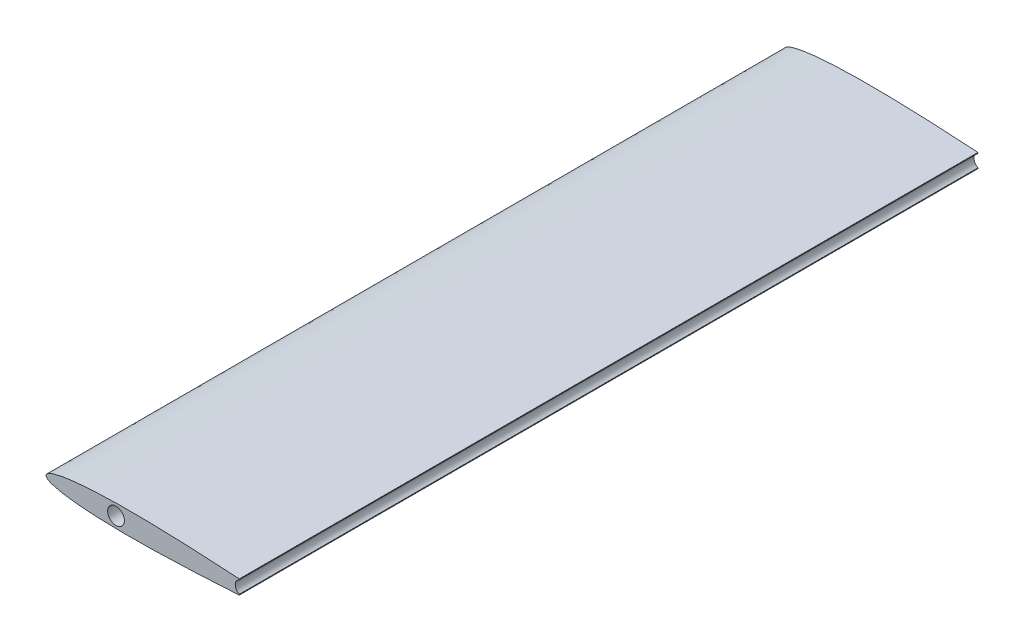
ISO-10303-21;
HEADER;
FILE_DESCRIPTION(('STEP AP214'),'2;1');
FILE_NAME('part.step','',(''),(''),'','','');
FILE_SCHEMA(('AUTOMOTIVE_DESIGN { 1 0 10303 214 1 1 1 1 }'));
ENDSEC;
DATA;
#1=APPLICATION_CONTEXT('core data for automotive mechanical design processes');
#2=APPLICATION_PROTOCOL_DEFINITION('international standard','automotive_design',2000,#1);
#3=PRODUCT_CONTEXT('',#1,'mechanical');
#4=PRODUCT('Part','Part','',(#3));
#5=PRODUCT_RELATED_PRODUCT_CATEGORY('part','',(#4));
#6=PRODUCT_DEFINITION_FORMATION('','',#4);
#7=PRODUCT_DEFINITION_CONTEXT('part definition',#1,'design');
#8=PRODUCT_DEFINITION('design','',#6,#7);
#9=PRODUCT_DEFINITION_SHAPE('','',#8);
#10=(LENGTH_UNIT() NAMED_UNIT(*) SI_UNIT(.MILLI.,.METRE.));
#11=(NAMED_UNIT(*) PLANE_ANGLE_UNIT() SI_UNIT($,.RADIAN.));
#12=(NAMED_UNIT(*) SI_UNIT($,.STERADIAN.) SOLID_ANGLE_UNIT());
#13=UNCERTAINTY_MEASURE_WITH_UNIT(LENGTH_MEASURE(1.E-05),#10,'distance_accuracy_value','');
#14=(GEOMETRIC_REPRESENTATION_CONTEXT(3) GLOBAL_UNCERTAINTY_ASSIGNED_CONTEXT((#13)) GLOBAL_UNIT_ASSIGNED_CONTEXT((#10,
#11,#12)) REPRESENTATION_CONTEXT('',''));
#15=CARTESIAN_POINT('',(0.,0.,0.));
#16=DIRECTION('',(0.,0.,1.));
#17=DIRECTION('',(1.,0.,0.));
#18=AXIS2_PLACEMENT_3D('',#15,#16,#17);
#19=CARTESIAN_POINT('',(100.,0.084,263.67));
#20=CARTESIAN_POINT('',(98.333488814933,0.236746480055364,263.67));
#21=CARTESIAN_POINT('',(95.0011947254255,0.542172688557606,263.67));
#22=CARTESIAN_POINT('',(88.3355596211879,1.11089898015662,263.67));
#23=CARTESIAN_POINT('',(80.0032933562199,1.76361099520967,263.67));
#24=CARTESIAN_POINT('',(70.0029989334555,2.45786169254404,263.67));
#25=CARTESIAN_POINT('',(60.0031046254057,3.06174772348002,263.67));
#26=CARTESIAN_POINT('',(50.0030086005351,3.55213921170033,263.67));
#27=CARTESIAN_POINT('',(40.0025985576922,3.90294649372571,263.67));
#28=CARTESIAN_POINT('',(31.666961485844,4.02526015065941,263.67));
#29=CARTESIAN_POINT('',(24.9991546003269,3.97693379087482,263.67));
#30=CARTESIAN_POINT('',(19.9977755867835,3.84497639830756,263.67));
#31=CARTESIAN_POINT('',(14.9933631314586,3.59248695861782,263.67));
#32=CARTESIAN_POINT('',(10.8271840648808,3.23765157891607,263.67));
#33=CARTESIAN_POINT('',(7.48905438800269,2.81402136675529,263.67));
#34=CARTESIAN_POINT('',(4.99359465012965,2.40367305928858,263.67));
#35=CARTESIAN_POINT('',(2.84962633983361,1.86792549429032,263.67));
#36=CARTESIAN_POINT('',(1.16541350274339,1.32098725183071,263.67));
#37=CARTESIAN_POINT('',(-0.664613784127027,0.,263.67));
#38=CARTESIAN_POINT('',(1.16541350274339,-1.32098725183071,263.67));
#39=CARTESIAN_POINT('',(2.84962633983362,-1.86792549429032,263.67));
#40=CARTESIAN_POINT('',(4.99359465012963,-2.40367305928857,263.67));
#41=CARTESIAN_POINT('',(7.48905438800269,-2.81402136675529,263.67));
#42=CARTESIAN_POINT('',(10.8271840648809,-3.23765157891607,263.67));
#43=CARTESIAN_POINT('',(14.9933631314586,-3.59248695861782,263.67));
#44=CARTESIAN_POINT('',(19.9977755867835,-3.84497639830756,263.67));
#45=CARTESIAN_POINT('',(24.9991546003269,-3.97693379087482,263.67));
#46=CARTESIAN_POINT('',(31.666961485844,-4.02526015065941,263.67));
#47=CARTESIAN_POINT('',(40.0025985576922,-3.90294649372571,263.67));
#48=CARTESIAN_POINT('',(50.0030086005351,-3.55213921170033,263.67));
#49=CARTESIAN_POINT('',(60.0031046254058,-3.06174772348002,263.67));
#50=CARTESIAN_POINT('',(70.0029989334555,-2.45786169254404,263.67));
#51=CARTESIAN_POINT('',(80.0032933562199,-1.76361099520967,263.67));
#52=CARTESIAN_POINT('',(88.3355596211879,-1.11089898015662,263.67));
#53=CARTESIAN_POINT('',(95.0011947254255,-0.542172688557605,263.67));
#54=CARTESIAN_POINT('',(98.333488814933,-0.236746480055364,263.67));
#55=CARTESIAN_POINT('',(100.,-0.084,263.67));
#56=B_SPLINE_CURVE_WITH_KNOTS('',3,(#19,#20,#21,#22,#23,#24,#25,#26,#27,#28,#29,#30,#31,#32,#33,
#34,#35,#36,#37,#38,#39,#40,#41,#42,#43,#44,#45,#46,#47,#48,#49,#50,#51,#52,#53,#54,#55),
.UNSPECIFIED.,.F.,.F.,(4,1,1,1,1,1,1,1,1,1,1,1,1,1,1,1,1,1,1,1,1,1,1,1,1,1,1,1,1,1,1,1,1,1,4),
(0.,0.0248762929189861,0.0497417146704998,0.0994434021110951,0.149112224036195,
0.198750974066913,0.248359097492202,0.297937369716024,0.347491327096237,0.37226694027957,
0.39705092368842,0.421859474838904,0.446731345826762,0.459220451479859,0.471790601601357,
0.484560454432956,0.491195112481227,0.5,0.508804887518773,0.515439545567044,0.528209398398643,
0.540779548520141,0.553268654173238,0.578140525161096,0.60294907631158,0.62773305972043,
0.652508672903763,0.702062630283976,0.751640902507798,0.801249025933086,0.850887775963805,
0.900556597888905,0.9502582853295,0.975123707081014,1.),.UNSPECIFIED.);
#57=DIRECTION('',(0.,0.,-1.));
#58=VECTOR('',#57,1.);
#59=SURFACE_OF_LINEAR_EXTRUSION('',#56,#58);
#60=CARTESIAN_POINT('',(100.,0.084,0.));
#61=CARTESIAN_POINT('',(98.333488814933,0.236746480055364,0.));
#62=CARTESIAN_POINT('',(95.0011947254255,0.542172688557606,0.));
#63=CARTESIAN_POINT('',(88.3355596211879,1.11089898015662,0.));
#64=CARTESIAN_POINT('',(80.0032933562199,1.76361099520967,0.));
#65=CARTESIAN_POINT('',(70.0029989334555,2.45786169254404,0.));
#66=CARTESIAN_POINT('',(60.0031046254057,3.06174772348002,0.));
#67=CARTESIAN_POINT('',(50.0030086005351,3.55213921170033,0.));
#68=CARTESIAN_POINT('',(40.0025985576922,3.90294649372571,0.));
#69=CARTESIAN_POINT('',(31.666961485844,4.02526015065941,0.));
#70=CARTESIAN_POINT('',(24.9991546003269,3.97693379087482,0.));
#71=CARTESIAN_POINT('',(19.9977755867835,3.84497639830756,0.));
#72=CARTESIAN_POINT('',(14.9933631314586,3.59248695861782,0.));
#73=CARTESIAN_POINT('',(10.8271840648808,3.23765157891607,0.));
#74=CARTESIAN_POINT('',(7.48905438800269,2.81402136675529,0.));
#75=CARTESIAN_POINT('',(4.99359465012965,2.40367305928858,0.));
#76=CARTESIAN_POINT('',(2.84962633983361,1.86792549429032,0.));
#77=CARTESIAN_POINT('',(1.16541350274339,1.32098725183071,0.));
#78=CARTESIAN_POINT('',(-0.664613784127027,0.,0.));
#79=CARTESIAN_POINT('',(1.16541350274339,-1.32098725183071,0.));
#80=CARTESIAN_POINT('',(2.84962633983362,-1.86792549429032,0.));
#81=CARTESIAN_POINT('',(4.99359465012963,-2.40367305928857,0.));
#82=CARTESIAN_POINT('',(7.48905438800269,-2.81402136675529,0.));
#83=CARTESIAN_POINT('',(10.8271840648809,-3.23765157891607,0.));
#84=CARTESIAN_POINT('',(14.9933631314586,-3.59248695861782,0.));
#85=CARTESIAN_POINT('',(19.9977755867835,-3.84497639830756,0.));
#86=CARTESIAN_POINT('',(24.9991546003269,-3.97693379087482,0.));
#87=CARTESIAN_POINT('',(31.666961485844,-4.02526015065941,0.));
#88=CARTESIAN_POINT('',(40.0025985576922,-3.90294649372571,0.));
#89=CARTESIAN_POINT('',(50.0030086005351,-3.55213921170033,0.));
#90=CARTESIAN_POINT('',(60.0031046254058,-3.06174772348002,0.));
#91=CARTESIAN_POINT('',(70.0029989334555,-2.45786169254404,0.));
#92=CARTESIAN_POINT('',(80.0032933562199,-1.76361099520967,0.));
#93=CARTESIAN_POINT('',(88.3355596211879,-1.11089898015662,0.));
#94=CARTESIAN_POINT('',(95.0011947254255,-0.542172688557605,0.));
#95=CARTESIAN_POINT('',(98.333488814933,-0.236746480055364,0.));
#96=CARTESIAN_POINT('',(100.,-0.084,0.));
#97=B_SPLINE_CURVE_WITH_KNOTS('',3,(#60,#61,#62,#63,#64,#65,#66,#67,#68,#69,#70,#71,#72,#73,#74,
#75,#76,#77,#78,#79,#80,#81,#82,#83,#84,#85,#86,#87,#88,#89,#90,#91,#92,#93,#94,#95,#96),
.UNSPECIFIED.,.F.,.F.,(4,1,1,1,1,1,1,1,1,1,1,1,1,1,1,1,1,1,1,1,1,1,1,1,1,1,1,1,1,1,1,1,1,1,4),
(0.,0.0248762929189861,0.0497417146704998,0.0994434021110951,0.149112224036195,
0.198750974066913,0.248359097492202,0.297937369716024,0.347491327096237,0.37226694027957,
0.39705092368842,0.421859474838904,0.446731345826762,0.459220451479859,0.471790601601357,
0.484560454432956,0.491195112481227,0.5,0.508804887518773,0.515439545567044,0.528209398398643,
0.540779548520141,0.553268654173238,0.578140525161096,0.60294907631158,0.62773305972043,
0.652508672903763,0.702062630283976,0.751640902507798,0.801249025933086,0.850887775963805,
0.900556597888905,0.9502582853295,0.975123707081014,1.),.UNSPECIFIED.);
#98=CARTESIAN_POINT('',(69.0000000000131,2.50744788017694,0.));
#99=VERTEX_POINT('',#98);
#100=CARTESIAN_POINT('',(69.0000000000148,-2.50744788017682,0.));
#101=VERTEX_POINT('',#100);
#102=EDGE_CURVE('E83',#99,#101,#97,.T.);
#103=ORIENTED_EDGE('',*,*,#102,.T.);
#104=DIRECTION('',(0.,0.,1.));
#105=VECTOR('',#104,1.);
#106=CARTESIAN_POINT('',(69.0000000000131,-2.50744788017495,0.));
#107=LINE('',#106,#105);
#108=CARTESIAN_POINT('',(69.0000000000131,-2.50744788017495,263.67));
#109=VERTEX_POINT('',#108);
#110=EDGE_CURVE('E54',#101,#109,#107,.T.);
#111=ORIENTED_EDGE('',*,*,#110,.T.);
#112=CARTESIAN_POINT('',(69.0000000000131,2.50744788017694,263.67));
#113=VERTEX_POINT('',#112);
#114=EDGE_CURVE('E85',#113,#109,#56,.T.);
#115=ORIENTED_EDGE('',*,*,#114,.F.);
#116=DIRECTION('',(0.,0.,1.));
#117=VECTOR('',#116,1.);
#118=CARTESIAN_POINT('',(69.0000000000131,2.50744788017694,0.));
#119=LINE('',#118,#117);
#120=EDGE_CURVE('E72',#99,#113,#119,.T.);
#121=ORIENTED_EDGE('',*,*,#120,.F.);
#122=EDGE_LOOP('',(#103,#111,#115,#121));
#123=FACE_BOUND('',#122,.T.);
#124=ADVANCED_FACE('F32',(#123),#59,.F.);
#125=CARTESIAN_POINT('',(70.0000000000131,9.91394466520745E-13,263.67));
#126=DIRECTION('',(0.,0.,-1.));
#127=DIRECTION('',(-1.,0.,0.));
#128=AXIS2_PLACEMENT_3D('',#125,#126,#127);
#129=CYLINDRICAL_SURFACE('',#128,2.44300000000014);
#130=CARTESIAN_POINT('',(70.0000000000131,9.91394466520745E-13,0.));
#131=DIRECTION('',(0.,0.,-1.));
#132=DIRECTION('',(1.,0.,0.));
#133=AXIS2_PLACEMENT_3D('',#130,#131,#132);
#134=CIRCLE('',#133,2.44300000000014);
#135=CARTESIAN_POINT('',(69.0000000000131,-2.22895693094243,0.));
#136=VERTEX_POINT('',#135);
#137=CARTESIAN_POINT('',(69.0000000000131,2.22895693094441,0.));
#138=VERTEX_POINT('',#137);
#139=EDGE_CURVE('E88',#136,#138,#134,.T.);
#140=ORIENTED_EDGE('',*,*,#139,.T.);
#141=DIRECTION('',(0.,0.,-1.));
#142=VECTOR('',#141,1.);
#143=CARTESIAN_POINT('',(69.0000000000131,2.22895693094441,263.67));
#144=LINE('',#143,#142);
#145=CARTESIAN_POINT('',(69.0000000000131,2.22895693094441,263.67));
#146=VERTEX_POINT('',#145);
#147=EDGE_CURVE('E47',#138,#146,#144,.F.);
#148=ORIENTED_EDGE('',*,*,#147,.T.);
#149=CARTESIAN_POINT('',(70.0000000000131,9.91394466520745E-13,263.67));
#150=DIRECTION('',(0.,0.,-1.));
#151=DIRECTION('',(1.,0.,0.));
#152=AXIS2_PLACEMENT_3D('',#149,#150,#151);
#153=CIRCLE('',#152,2.44300000000014);
#154=CARTESIAN_POINT('',(69.0000000000131,-2.22895693094243,263.67));
#155=VERTEX_POINT('',#154);
#156=EDGE_CURVE('E40',#155,#146,#153,.T.);
#157=ORIENTED_EDGE('',*,*,#156,.F.);
#158=DIRECTION('',(0.,0.,-1.));
#159=VECTOR('',#158,1.);
#160=CARTESIAN_POINT('',(69.0000000000131,-2.22895693094243,263.67));
#161=LINE('',#160,#159);
#162=EDGE_CURVE('E90',#155,#136,#161,.T.);
#163=ORIENTED_EDGE('',*,*,#162,.T.);
#164=EDGE_LOOP('',(#140,#148,#157,#163));
#165=FACE_BOUND('',#164,.T.);
#166=ADVANCED_FACE('F124',(#165),#129,.F.);
#167=CARTESIAN_POINT('',(0.,0.,263.67));
#168=DIRECTION('',(0.,0.,-1.));
#169=DIRECTION('',(-1.,0.,0.));
#170=AXIS2_PLACEMENT_3D('',#167,#168,#169);
#171=PLANE('',#170);
#172=CARTESIAN_POINT('',(25.,0.,263.67));
#173=DIRECTION('',(0.,0.,1.));
#174=DIRECTION('',(1.,0.,0.));
#175=AXIS2_PLACEMENT_3D('',#172,#173,#174);
#176=CIRCLE('',#175,3.);
#177=CARTESIAN_POINT('',(28.,0.,263.67));
#178=VERTEX_POINT('',#177);
#179=EDGE_CURVE('E111',#178,#178,#176,.T.);
#180=ORIENTED_EDGE('',*,*,#179,.F.);
#181=EDGE_LOOP('',(#180));
#182=FACE_BOUND('',#181,.T.);
#183=ORIENTED_EDGE('',*,*,#114,.T.);
#184=DIRECTION('',(0.,-1.,0.));
#185=VECTOR('',#184,1.);
#186=CARTESIAN_POINT('',(69.0000000000131,2.50744788017694,263.67));
#187=LINE('',#186,#185);
#188=EDGE_CURVE('E109',#155,#109,#187,.T.);
#189=ORIENTED_EDGE('',*,*,#188,.F.);
#190=ORIENTED_EDGE('',*,*,#156,.T.);
#191=EDGE_CURVE('E78',#113,#146,#187,.T.);
#192=ORIENTED_EDGE('',*,*,#191,.F.);
#193=EDGE_LOOP('',(#183,#189,#190,#192));
#194=FACE_BOUND('',#193,.T.);
#195=ADVANCED_FACE('F122',(#182,#194),#171,.F.);
#196=CARTESIAN_POINT('',(0.,0.,0.));
#197=DIRECTION('',(0.,0.,-1.));
#198=DIRECTION('',(-1.,0.,0.));
#199=AXIS2_PLACEMENT_3D('',#196,#197,#198);
#200=PLANE('',#199);
#201=CARTESIAN_POINT('',(25.,0.,0.));
#202=DIRECTION('',(0.,0.,1.));
#203=DIRECTION('',(1.,0.,0.));
#204=AXIS2_PLACEMENT_3D('',#201,#202,#203);
#205=CIRCLE('',#204,3.);
#206=CARTESIAN_POINT('',(28.,0.,0.));
#207=VERTEX_POINT('',#206);
#208=EDGE_CURVE('E114',#207,#207,#205,.T.);
#209=ORIENTED_EDGE('',*,*,#208,.T.);
#210=EDGE_LOOP('',(#209));
#211=FACE_BOUND('',#210,.T.);
#212=DIRECTION('',(0.,1.,0.));
#213=VECTOR('',#212,1.);
#214=CARTESIAN_POINT('',(69.0000000000131,0.,0.));
#215=LINE('',#214,#213);
#216=EDGE_CURVE('E11',#101,#136,#215,.T.);
#217=ORIENTED_EDGE('',*,*,#216,.F.);
#218=ORIENTED_EDGE('',*,*,#102,.F.);
#219=DIRECTION('',(0.,-1.,0.));
#220=VECTOR('',#219,1.);
#221=CARTESIAN_POINT('',(69.0000000000131,2.50744788017694,0.));
#222=LINE('',#221,#220);
#223=EDGE_CURVE('E69',#99,#138,#222,.T.);
#224=ORIENTED_EDGE('',*,*,#223,.T.);
#225=ORIENTED_EDGE('',*,*,#139,.F.);
#226=EDGE_LOOP('',(#217,#218,#224,#225));
#227=FACE_BOUND('',#226,.T.);
#228=ADVANCED_FACE('F87',(#211,#227),#200,.T.);
#229=CARTESIAN_POINT('',(69.0000000000131,2.50744788017694,0.));
#230=DIRECTION('',(-1.,0.,0.));
#231=DIRECTION('',(0.,0.,1.));
#232=AXIS2_PLACEMENT_3D('',#229,#230,#231);
#233=PLANE('',#232);
#234=ORIENTED_EDGE('',*,*,#223,.F.);
#235=ORIENTED_EDGE('',*,*,#120,.T.);
#236=ORIENTED_EDGE('',*,*,#191,.T.);
#237=ORIENTED_EDGE('',*,*,#147,.F.);
#238=EDGE_LOOP('',(#234,#235,#236,#237));
#239=FACE_BOUND('',#238,.T.);
#240=ADVANCED_FACE('F71',(#239),#233,.F.);
#241=ORIENTED_EDGE('',*,*,#188,.T.);
#242=ORIENTED_EDGE('',*,*,#110,.F.);
#243=ORIENTED_EDGE('',*,*,#216,.T.);
#244=ORIENTED_EDGE('',*,*,#162,.F.);
#245=EDGE_LOOP('',(#241,#242,#243,#244));
#246=FACE_BOUND('',#245,.T.);
#247=ADVANCED_FACE('F119',(#246),#233,.F.);
#248=CARTESIAN_POINT('',(25.,0.,0.));
#249=DIRECTION('',(0.,0.,1.));
#250=DIRECTION('',(1.,0.,0.));
#251=AXIS2_PLACEMENT_3D('',#248,#249,#250);
#252=CYLINDRICAL_SURFACE('',#251,3.);
#253=ORIENTED_EDGE('',*,*,#208,.F.);
#254=EDGE_LOOP('',(#253));
#255=FACE_BOUND('',#254,.T.);
#256=ORIENTED_EDGE('',*,*,#179,.T.);
#257=EDGE_LOOP('',(#256));
#258=FACE_BOUND('',#257,.T.);
#259=ADVANCED_FACE('F137',(#255,#258),#252,.F.);
#260=CLOSED_SHELL('',(#124,#166,#195,#228,#240,#247,#259));
#261=MANIFOLD_SOLID_BREP('B2',#260);
#262=ADVANCED_BREP_SHAPE_REPRESENTATION('',(#18,#261),#14);
#263=SHAPE_DEFINITION_REPRESENTATION(#9,#262);
ENDSEC;
END-ISO-10303-21;
